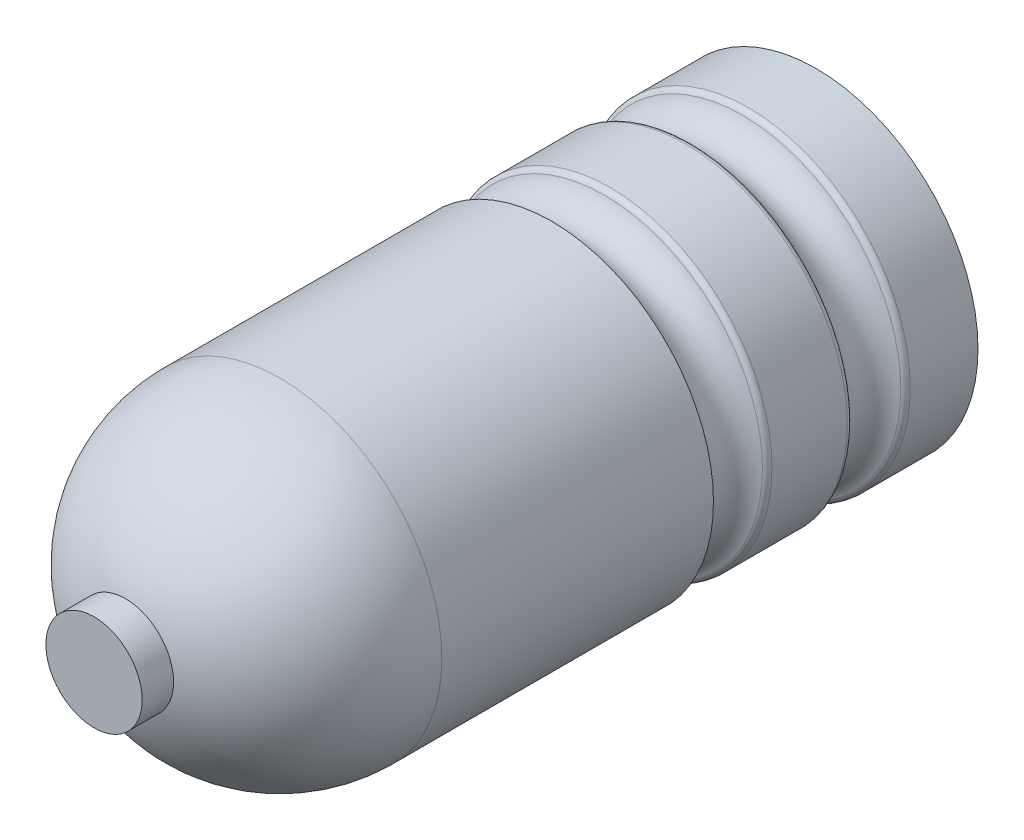
ISO-10303-21;
HEADER;
FILE_DESCRIPTION(('STEP AP214'),'2;1');
FILE_NAME('part.step','',(''),(''),'','','');
FILE_SCHEMA(('AUTOMOTIVE_DESIGN { 1 0 10303 214 1 1 1 1 }'));
ENDSEC;
DATA;
#1=APPLICATION_CONTEXT('core data for automotive mechanical design processes');
#2=APPLICATION_PROTOCOL_DEFINITION('international standard','automotive_design',2000,#1);
#3=PRODUCT_CONTEXT('',#1,'mechanical');
#4=PRODUCT('Part','Part','',(#3));
#5=PRODUCT_RELATED_PRODUCT_CATEGORY('part','',(#4));
#6=PRODUCT_DEFINITION_FORMATION('','',#4);
#7=PRODUCT_DEFINITION_CONTEXT('part definition',#1,'design');
#8=PRODUCT_DEFINITION('design','',#6,#7);
#9=PRODUCT_DEFINITION_SHAPE('','',#8);
#10=(LENGTH_UNIT() NAMED_UNIT(*) SI_UNIT(.MILLI.,.METRE.));
#11=(NAMED_UNIT(*) PLANE_ANGLE_UNIT() SI_UNIT($,.RADIAN.));
#12=(NAMED_UNIT(*) SI_UNIT($,.STERADIAN.) SOLID_ANGLE_UNIT());
#13=UNCERTAINTY_MEASURE_WITH_UNIT(LENGTH_MEASURE(1.E-05),#10,'distance_accuracy_value','');
#14=(GEOMETRIC_REPRESENTATION_CONTEXT(3) GLOBAL_UNCERTAINTY_ASSIGNED_CONTEXT((#13)) GLOBAL_UNIT_ASSIGNED_CONTEXT((#10,
#11,#12)) REPRESENTATION_CONTEXT('',''));
#15=CARTESIAN_POINT('',(0.,0.,0.));
#16=DIRECTION('',(0.,0.,1.));
#17=DIRECTION('',(1.,0.,0.));
#18=AXIS2_PLACEMENT_3D('',#15,#16,#17);
#19=CARTESIAN_POINT('',(-1.09287578986539E-13,0.,6.54999999999993));
#20=DIRECTION('',(0.,0.,1.));
#21=DIRECTION('',(1.,0.,0.));
#22=AXIS2_PLACEMENT_3D('',#19,#20,#21);
#23=SPHERICAL_SURFACE('',#22,13.4500000000001);
#24=CARTESIAN_POINT('',(0.,0.,6.55));
#25=DIRECTION('',(0.,0.,1.));
#26=DIRECTION('',(1.,0.,0.));
#27=AXIS2_PLACEMENT_3D('',#24,#25,#26);
#28=CIRCLE('',#27,13.45);
#29=CARTESIAN_POINT('',(13.45,0.,6.55));
#30=VERTEX_POINT('',#29);
#31=EDGE_CURVE('E71',#30,#30,#28,.T.);
#32=ORIENTED_EDGE('',*,*,#31,.T.);
#33=EDGE_LOOP('',(#32));
#34=FACE_BOUND('',#33,.T.);
#35=CARTESIAN_POINT('',(0.,0.,19.3914368354947));
#36=DIRECTION('',(0.,0.,1.));
#37=DIRECTION('',(1.,0.,0.));
#38=AXIS2_PLACEMENT_3D('',#35,#36,#37);
#39=CIRCLE('',#38,4.00000000000001);
#40=CARTESIAN_POINT('',(4.00000000000001,0.,19.3914368354947));
#41=VERTEX_POINT('',#40);
#42=EDGE_CURVE('E74',#41,#41,#39,.T.);
#43=ORIENTED_EDGE('',*,*,#42,.F.);
#44=EDGE_LOOP('',(#43));
#45=FACE_BOUND('',#44,.T.);
#46=ADVANCED_FACE('F39',(#34,#45),#23,.T.);
#47=CARTESIAN_POINT('',(0.,0.,12.));
#48=DIRECTION('',(0.,0.,1.));
#49=DIRECTION('',(1.,0.,0.));
#50=AXIS2_PLACEMENT_3D('',#47,#48,#49);
#51=CYLINDRICAL_SURFACE('',#50,4.00000000000001);
#52=ORIENTED_EDGE('',*,*,#42,.T.);
#53=EDGE_LOOP('',(#52));
#54=FACE_BOUND('',#53,.T.);
#55=CARTESIAN_POINT('',(0.,0.,21.9999999999999));
#56=DIRECTION('',(0.,0.,1.));
#57=DIRECTION('',(1.,0.,0.));
#58=AXIS2_PLACEMENT_3D('',#55,#56,#57);
#59=CIRCLE('',#58,4.);
#60=CARTESIAN_POINT('',(4.,0.,21.9999999999999));
#61=VERTEX_POINT('',#60);
#62=EDGE_CURVE('E77',#61,#61,#59,.T.);
#63=ORIENTED_EDGE('',*,*,#62,.F.);
#64=EDGE_LOOP('',(#63));
#65=FACE_BOUND('',#64,.T.);
#66=ADVANCED_FACE('F83',(#54,#65),#51,.T.);
#67=CARTESIAN_POINT('',(4.,0.,21.9999999999999));
#68=DIRECTION('',(0.,0.,1.));
#69=DIRECTION('',(1.,0.,0.));
#70=AXIS2_PLACEMENT_3D('',#67,#68,#69);
#71=PLANE('',#70);
#72=ORIENTED_EDGE('',*,*,#62,.T.);
#73=EDGE_LOOP('',(#72));
#74=FACE_BOUND('',#73,.T.);
#75=ADVANCED_FACE('F81',(#74),#71,.T.);
#76=CARTESIAN_POINT('',(0.,0.,-38.));
#77=DIRECTION('',(0.,0.,-1.));
#78=DIRECTION('',(-1.,0.,0.));
#79=AXIS2_PLACEMENT_3D('',#76,#77,#78);
#80=CYLINDRICAL_SURFACE('',#79,13.45);
#81=CARTESIAN_POINT('',(0.,0.,-16.0200222717426));
#82=DIRECTION('',(0.,0.,-1.));
#83=DIRECTION('',(-1.,0.,0.));
#84=AXIS2_PLACEMENT_3D('',#81,#82,#83);
#85=CIRCLE('',#84,13.45);
#86=CARTESIAN_POINT('',(-13.45,0.,-16.0200222717426));
#87=VERTEX_POINT('',#86);
#88=EDGE_CURVE('E65',#87,#87,#85,.T.);
#89=ORIENTED_EDGE('',*,*,#88,.F.);
#90=EDGE_LOOP('',(#89));
#91=FACE_BOUND('',#90,.T.);
#92=ORIENTED_EDGE('',*,*,#31,.F.);
#93=EDGE_LOOP('',(#92));
#94=FACE_BOUND('',#93,.T.);
#95=ADVANCED_FACE('F91',(#91,#94),#80,.T.);
#96=CARTESIAN_POINT('',(0.,0.,-18.2650167038069));
#97=DIRECTION('',(0.,0.,-1.));
#98=DIRECTION('',(-1.,0.,0.));
#99=AXIS2_PLACEMENT_3D('',#96,#97,#98);
#100=TOROIDAL_SURFACE('',#99,13.95,2.3);
#101=CARTESIAN_POINT('',(0.,0.,-20.4133311831234));
#102=DIRECTION('',(0.,0.,1.));
#103=DIRECTION('',(1.,0.,0.));
#104=AXIS2_PLACEMENT_3D('',#101,#102,#103);
#105=CIRCLE('',#104,13.1285714285714);
#106=CARTESIAN_POINT('',(13.1285714285714,0.,-20.4133311831234));
#107=VERTEX_POINT('',#106);
#108=EDGE_CURVE('E54',#107,#107,#105,.T.);
#109=ORIENTED_EDGE('',*,*,#108,.T.);
#110=EDGE_LOOP('',(#109));
#111=FACE_BOUND('',#110,.T.);
#112=ORIENTED_EDGE('',*,*,#88,.T.);
#113=EDGE_LOOP('',(#112));
#114=FACE_BOUND('',#113,.T.);
#115=ADVANCED_FACE('F110',(#111,#114),#100,.F.);
#116=CARTESIAN_POINT('',(0.,0.,-38.));
#117=DIRECTION('',(0.,0.,-1.));
#118=DIRECTION('',(-1.,0.,0.));
#119=AXIS2_PLACEMENT_3D('',#116,#117,#118);
#120=CYLINDRICAL_SURFACE('',#119,13.45);
#121=CARTESIAN_POINT('',(0.,0.,-20.8803560699313));
#122=DIRECTION('',(0.,0.,1.));
#123=DIRECTION('',(1.,0.,0.));
#124=AXIS2_PLACEMENT_3D('',#121,#122,#123);
#125=CIRCLE('',#124,13.45);
#126=CARTESIAN_POINT('',(13.45,0.,-20.8803560699313));
#127=VERTEX_POINT('',#126);
#128=EDGE_CURVE('E59',#127,#127,#125,.F.);
#129=ORIENTED_EDGE('',*,*,#128,.T.);
#130=EDGE_LOOP('',(#129));
#131=FACE_BOUND('',#130,.T.);
#132=CARTESIAN_POINT('',(0.,0.,-27.1396662018112));
#133=DIRECTION('',(0.,0.,1.));
#134=DIRECTION('',(1.,0.,0.));
#135=AXIS2_PLACEMENT_3D('',#132,#133,#134);
#136=CIRCLE('',#135,13.45);
#137=CARTESIAN_POINT('',(13.45,0.,-27.1396662018112));
#138=VERTEX_POINT('',#137);
#139=EDGE_CURVE('E62',#138,#138,#136,.T.);
#140=ORIENTED_EDGE('',*,*,#139,.T.);
#141=EDGE_LOOP('',(#140));
#142=FACE_BOUND('',#141,.T.);
#143=ADVANCED_FACE('F107',(#131,#142),#120,.T.);
#144=CARTESIAN_POINT('',(0.,0.,-29.7550055679356));
#145=DIRECTION('',(0.,0.,-1.));
#146=DIRECTION('',(-1.,0.,0.));
#147=AXIS2_PLACEMENT_3D('',#144,#145,#146);
#148=TOROIDAL_SURFACE('',#147,13.95,2.3);
#149=CARTESIAN_POINT('',(0.,0.,-27.6066910886192));
#150=DIRECTION('',(0.,0.,-1.));
#151=DIRECTION('',(-1.,0.,0.));
#152=AXIS2_PLACEMENT_3D('',#149,#150,#151);
#153=CIRCLE('',#152,13.1285714285715);
#154=CARTESIAN_POINT('',(-13.1285714285715,0.,-27.6066910886192));
#155=VERTEX_POINT('',#154);
#156=EDGE_CURVE('E46',#155,#155,#153,.T.);
#157=ORIENTED_EDGE('',*,*,#156,.T.);
#158=EDGE_LOOP('',(#157));
#159=FACE_BOUND('',#158,.T.);
#160=CARTESIAN_POINT('',(0.,0.,-31.9033200472521));
#161=DIRECTION('',(0.,0.,1.));
#162=DIRECTION('',(1.,0.,0.));
#163=AXIS2_PLACEMENT_3D('',#160,#161,#162);
#164=CIRCLE('',#163,13.1285714285714);
#165=CARTESIAN_POINT('',(13.1285714285714,0.,-31.9033200472521));
#166=VERTEX_POINT('',#165);
#167=EDGE_CURVE('E50',#166,#166,#164,.T.);
#168=ORIENTED_EDGE('',*,*,#167,.T.);
#169=EDGE_LOOP('',(#168));
#170=FACE_BOUND('',#169,.T.);
#171=ADVANCED_FACE('F104',(#159,#170),#148,.F.);
#172=CARTESIAN_POINT('',(0.,0.,-38.));
#173=DIRECTION('',(0.,0.,-1.));
#174=DIRECTION('',(-1.,0.,0.));
#175=AXIS2_PLACEMENT_3D('',#172,#173,#174);
#176=CYLINDRICAL_SURFACE('',#175,13.45);
#177=CARTESIAN_POINT('',(0.,0.,-32.37034493406));
#178=DIRECTION('',(0.,0.,1.));
#179=DIRECTION('',(1.,0.,0.));
#180=AXIS2_PLACEMENT_3D('',#177,#178,#179);
#181=CIRCLE('',#180,13.45);
#182=CARTESIAN_POINT('',(13.45,0.,-32.37034493406));
#183=VERTEX_POINT('',#182);
#184=EDGE_CURVE('E10',#183,#183,#181,.F.);
#185=ORIENTED_EDGE('',*,*,#184,.T.);
#186=EDGE_LOOP('',(#185));
#187=FACE_BOUND('',#186,.T.);
#188=CARTESIAN_POINT('',(0.,0.,-38.));
#189=DIRECTION('',(0.,0.,-1.));
#190=DIRECTION('',(-1.,0.,0.));
#191=AXIS2_PLACEMENT_3D('',#188,#189,#190);
#192=CIRCLE('',#191,13.45);
#193=CARTESIAN_POINT('',(-13.45,0.,-38.));
#194=VERTEX_POINT('',#193);
#195=EDGE_CURVE('E68',#194,#194,#192,.T.);
#196=ORIENTED_EDGE('',*,*,#195,.F.);
#197=EDGE_LOOP('',(#196));
#198=FACE_BOUND('',#197,.T.);
#199=ADVANCED_FACE('F100',(#187,#198),#176,.T.);
#200=CARTESIAN_POINT('',(13.45,0.,-38.));
#201=DIRECTION('',(0.,0.,1.));
#202=DIRECTION('',(1.,0.,0.));
#203=AXIS2_PLACEMENT_3D('',#200,#201,#202);
#204=PLANE('',#203);
#205=ORIENTED_EDGE('',*,*,#195,.T.);
#206=EDGE_LOOP('',(#205));
#207=FACE_BOUND('',#206,.T.);
#208=ADVANCED_FACE('F96',(#207),#204,.F.);
#209=CARTESIAN_POINT('',(0.,0.,-20.8803560699313));
#210=DIRECTION('',(0.,0.,1.));
#211=DIRECTION('',(1.,0.,0.));
#212=AXIS2_PLACEMENT_3D('',#209,#210,#211);
#213=TOROIDAL_SURFACE('',#212,12.95,0.5);
#214=ORIENTED_EDGE('',*,*,#108,.F.);
#215=EDGE_LOOP('',(#214));
#216=FACE_BOUND('',#215,.T.);
#217=ORIENTED_EDGE('',*,*,#128,.F.);
#218=EDGE_LOOP('',(#217));
#219=FACE_BOUND('',#218,.T.);
#220=ADVANCED_FACE('F99',(#216,#219),#213,.T.);
#221=CARTESIAN_POINT('',(0.,0.,-27.1396662018112));
#222=DIRECTION('',(0.,0.,1.));
#223=DIRECTION('',(1.,0.,0.));
#224=AXIS2_PLACEMENT_3D('',#221,#222,#223);
#225=TOROIDAL_SURFACE('',#224,12.95,0.5);
#226=ORIENTED_EDGE('',*,*,#139,.F.);
#227=EDGE_LOOP('',(#226));
#228=FACE_BOUND('',#227,.T.);
#229=ORIENTED_EDGE('',*,*,#156,.F.);
#230=EDGE_LOOP('',(#229));
#231=FACE_BOUND('',#230,.T.);
#232=ADVANCED_FACE('F119',(#228,#231),#225,.T.);
#233=CARTESIAN_POINT('',(0.,0.,-32.37034493406));
#234=DIRECTION('',(0.,0.,1.));
#235=DIRECTION('',(1.,0.,0.));
#236=AXIS2_PLACEMENT_3D('',#233,#234,#235);
#237=TOROIDAL_SURFACE('',#236,12.95,0.5);
#238=ORIENTED_EDGE('',*,*,#167,.F.);
#239=EDGE_LOOP('',(#238));
#240=FACE_BOUND('',#239,.T.);
#241=ORIENTED_EDGE('',*,*,#184,.F.);
#242=EDGE_LOOP('',(#241));
#243=FACE_BOUND('',#242,.T.);
#244=ADVANCED_FACE('F41',(#240,#243),#237,.T.);
#245=CLOSED_SHELL('',(#46,#66,#75,#95,#115,#143,#171,#199,#208,#220,#232,#244));
#246=MANIFOLD_SOLID_BREP('B2',#245);
#247=ADVANCED_BREP_SHAPE_REPRESENTATION('',(#18,#246),#14);
#248=SHAPE_DEFINITION_REPRESENTATION(#9,#247);
ENDSEC;
END-ISO-10303-21;
